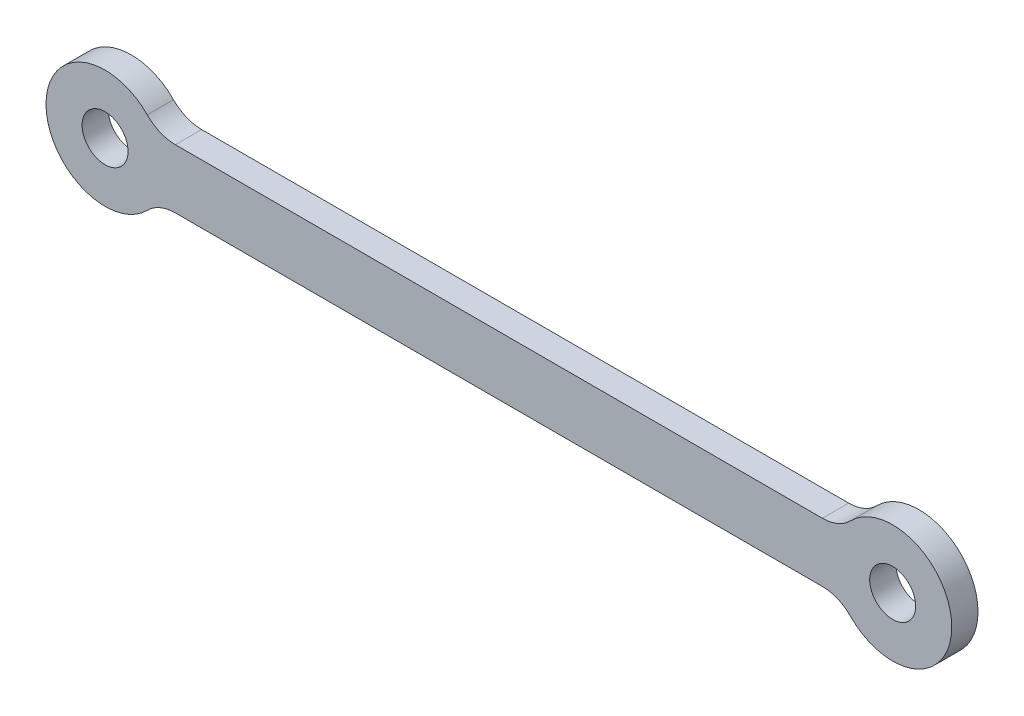
ISO-10303-21;
HEADER;
FILE_DESCRIPTION(('STEP AP214'),'2;1');
FILE_NAME('part.step','',(''),(''),'','','');
FILE_SCHEMA(('AUTOMOTIVE_DESIGN { 1 0 10303 214 1 1 1 1 }'));
ENDSEC;
DATA;
#1=APPLICATION_CONTEXT('core data for automotive mechanical design processes');
#2=APPLICATION_PROTOCOL_DEFINITION('international standard','automotive_design',2000,#1);
#3=PRODUCT_CONTEXT('',#1,'mechanical');
#4=PRODUCT('Part','Part','',(#3));
#5=PRODUCT_RELATED_PRODUCT_CATEGORY('part','',(#4));
#6=PRODUCT_DEFINITION_FORMATION('','',#4);
#7=PRODUCT_DEFINITION_CONTEXT('part definition',#1,'design');
#8=PRODUCT_DEFINITION('design','',#6,#7);
#9=PRODUCT_DEFINITION_SHAPE('','',#8);
#10=(LENGTH_UNIT() NAMED_UNIT(*) SI_UNIT(.MILLI.,.METRE.));
#11=(NAMED_UNIT(*) PLANE_ANGLE_UNIT() SI_UNIT($,.RADIAN.));
#12=(NAMED_UNIT(*) SI_UNIT($,.STERADIAN.) SOLID_ANGLE_UNIT());
#13=UNCERTAINTY_MEASURE_WITH_UNIT(LENGTH_MEASURE(1.E-05),#10,'distance_accuracy_value','');
#14=(GEOMETRIC_REPRESENTATION_CONTEXT(3) GLOBAL_UNCERTAINTY_ASSIGNED_CONTEXT((#13)) GLOBAL_UNIT_ASSIGNED_CONTEXT((#10,
#11,#12)) REPRESENTATION_CONTEXT('',''));
#15=CARTESIAN_POINT('',(0.,0.,0.));
#16=DIRECTION('',(0.,0.,1.));
#17=DIRECTION('',(1.,0.,0.));
#18=AXIS2_PLACEMENT_3D('',#15,#16,#17);
#19=CARTESIAN_POINT('',(54.6439286785929,-5.25,2.));
#20=DIRECTION('',(0.,0.,1.));
#21=DIRECTION('',(1.,0.,0.));
#22=AXIS2_PLACEMENT_3D('',#19,#20,#21);
#23=PLANE('',#22);
#24=CARTESIAN_POINT('',(0.,0.,2.));
#25=DIRECTION('',(0.,0.,1.));
#26=DIRECTION('',(1.,0.,0.));
#27=AXIS2_PLACEMENT_3D('',#24,#25,#26);
#28=CIRCLE('',#27,1.75);
#29=CARTESIAN_POINT('',(1.75,0.,2.));
#30=VERTEX_POINT('',#29);
#31=EDGE_CURVE('E138',#30,#30,#28,.T.);
#32=ORIENTED_EDGE('',*,*,#31,.F.);
#33=EDGE_LOOP('',(#32));
#34=FACE_BOUND('',#33,.T.);
#35=CARTESIAN_POINT('',(54.6439286785929,-5.25,2.));
#36=DIRECTION('',(0.,0.,-1.));
#37=DIRECTION('',(1.,0.,0.));
#38=AXIS2_PLACEMENT_3D('',#35,#36,#37);
#39=CIRCLE('',#38,3.);
#40=CARTESIAN_POINT('',(54.6439286785929,-2.25,2.));
#41=VERTEX_POINT('',#40);
#42=CARTESIAN_POINT('',(56.7863572071557,-3.15,2.));
#43=VERTEX_POINT('',#42);
#44=EDGE_CURVE('E149',#41,#43,#39,.T.);
#45=ORIENTED_EDGE('',*,*,#44,.T.);
#46=CARTESIAN_POINT('',(60.,0.,2.));
#47=DIRECTION('',(0.,0.,1.));
#48=DIRECTION('',(1.,0.,0.));
#49=AXIS2_PLACEMENT_3D('',#46,#47,#48);
#50=CIRCLE('',#49,4.50000000000001);
#51=CARTESIAN_POINT('',(56.7863572071557,3.15,2.));
#52=VERTEX_POINT('',#51);
#53=EDGE_CURVE('E97',#43,#52,#50,.T.);
#54=ORIENTED_EDGE('',*,*,#53,.T.);
#55=CARTESIAN_POINT('',(54.6439286785929,5.25,2.));
#56=DIRECTION('',(0.,0.,-1.));
#57=DIRECTION('',(1.,0.,0.));
#58=AXIS2_PLACEMENT_3D('',#55,#56,#57);
#59=CIRCLE('',#58,3.);
#60=CARTESIAN_POINT('',(54.6439286785929,2.25,2.));
#61=VERTEX_POINT('',#60);
#62=EDGE_CURVE('E164',#52,#61,#59,.T.);
#63=ORIENTED_EDGE('',*,*,#62,.T.);
#64=DIRECTION('',(-1.,0.,0.));
#65=VECTOR('',#64,1.);
#66=CARTESIAN_POINT('',(5.35607132140713,2.25000000000001,2.));
#67=LINE('',#66,#65);
#68=CARTESIAN_POINT('',(5.35607132140713,2.25000000000001,2.));
#69=VERTEX_POINT('',#68);
#70=EDGE_CURVE('E177',#61,#69,#67,.T.);
#71=ORIENTED_EDGE('',*,*,#70,.T.);
#72=CARTESIAN_POINT('',(5.35607132140713,5.25000000000001,2.));
#73=DIRECTION('',(0.,0.,-1.));
#74=DIRECTION('',(-1.,0.,0.));
#75=AXIS2_PLACEMENT_3D('',#72,#73,#74);
#76=CIRCLE('',#75,3.);
#77=CARTESIAN_POINT('',(3.21364279284428,3.15,2.));
#78=VERTEX_POINT('',#77);
#79=EDGE_CURVE('E116',#69,#78,#76,.T.);
#80=ORIENTED_EDGE('',*,*,#79,.T.);
#81=CARTESIAN_POINT('',(0.,0.,2.));
#82=DIRECTION('',(0.,0.,1.));
#83=DIRECTION('',(1.,0.,0.));
#84=AXIS2_PLACEMENT_3D('',#81,#82,#83);
#85=CIRCLE('',#84,4.5);
#86=CARTESIAN_POINT('',(3.21364279284428,-3.15,2.));
#87=VERTEX_POINT('',#86);
#88=EDGE_CURVE('E110',#78,#87,#85,.T.);
#89=ORIENTED_EDGE('',*,*,#88,.T.);
#90=CARTESIAN_POINT('',(5.35607132140713,-5.25000000000001,2.));
#91=DIRECTION('',(0.,0.,-1.));
#92=DIRECTION('',(1.,0.,0.));
#93=AXIS2_PLACEMENT_3D('',#90,#91,#92);
#94=CIRCLE('',#93,3.);
#95=CARTESIAN_POINT('',(5.35607132140713,-2.25000000000001,2.));
#96=VERTEX_POINT('',#95);
#97=EDGE_CURVE('E114',#87,#96,#94,.T.);
#98=ORIENTED_EDGE('',*,*,#97,.T.);
#99=DIRECTION('',(1.,0.,0.));
#100=VECTOR('',#99,1.);
#101=CARTESIAN_POINT('',(54.6439286785929,-2.25,2.));
#102=LINE('',#101,#100);
#103=EDGE_CURVE('E54',#96,#41,#102,.T.);
#104=ORIENTED_EDGE('',*,*,#103,.T.);
#105=EDGE_LOOP('',(#45,#54,#63,#71,#80,#89,#98,#104));
#106=FACE_BOUND('',#105,.T.);
#107=CARTESIAN_POINT('',(60.,0.,2.));
#108=DIRECTION('',(0.,0.,1.));
#109=DIRECTION('',(1.,0.,0.));
#110=AXIS2_PLACEMENT_3D('',#107,#108,#109);
#111=CIRCLE('',#110,1.75);
#112=CARTESIAN_POINT('',(61.75,0.,2.));
#113=VERTEX_POINT('',#112);
#114=EDGE_CURVE('E186',#113,#113,#111,.T.);
#115=ORIENTED_EDGE('',*,*,#114,.F.);
#116=EDGE_LOOP('',(#115));
#117=FACE_BOUND('',#116,.T.);
#118=ADVANCED_FACE('F37',(#34,#106,#117),#23,.T.);
#119=CARTESIAN_POINT('',(54.6439286785929,-5.25,0.));
#120=DIRECTION('',(0.,0.,1.));
#121=DIRECTION('',(1.,0.,0.));
#122=AXIS2_PLACEMENT_3D('',#119,#120,#121);
#123=PLANE('',#122);
#124=CARTESIAN_POINT('',(54.6439286785929,-5.25,0.));
#125=DIRECTION('',(0.,0.,-1.));
#126=DIRECTION('',(1.,0.,0.));
#127=AXIS2_PLACEMENT_3D('',#124,#125,#126);
#128=CIRCLE('',#127,3.);
#129=CARTESIAN_POINT('',(54.6439286785929,-2.25,0.));
#130=VERTEX_POINT('',#129);
#131=CARTESIAN_POINT('',(56.7863572071557,-3.15,0.));
#132=VERTEX_POINT('',#131);
#133=EDGE_CURVE('E134',#130,#132,#128,.T.);
#134=ORIENTED_EDGE('',*,*,#133,.F.);
#135=DIRECTION('',(1.,0.,0.));
#136=VECTOR('',#135,1.);
#137=CARTESIAN_POINT('',(54.6439286785929,-2.25,0.));
#138=LINE('',#137,#136);
#139=CARTESIAN_POINT('',(5.35607132140713,-2.25000000000001,0.));
#140=VERTEX_POINT('',#139);
#141=EDGE_CURVE('E89',#140,#130,#138,.T.);
#142=ORIENTED_EDGE('',*,*,#141,.F.);
#143=CARTESIAN_POINT('',(5.35607132140713,-5.25000000000001,0.));
#144=DIRECTION('',(0.,0.,-1.));
#145=DIRECTION('',(1.,0.,0.));
#146=AXIS2_PLACEMENT_3D('',#143,#144,#145);
#147=CIRCLE('',#146,3.);
#148=CARTESIAN_POINT('',(3.21364279284428,-3.15,0.));
#149=VERTEX_POINT('',#148);
#150=EDGE_CURVE('E83',#149,#140,#147,.T.);
#151=ORIENTED_EDGE('',*,*,#150,.F.);
#152=CARTESIAN_POINT('',(0.,0.,0.));
#153=DIRECTION('',(0.,0.,1.));
#154=DIRECTION('',(1.,0.,0.));
#155=AXIS2_PLACEMENT_3D('',#152,#153,#154);
#156=CIRCLE('',#155,4.5);
#157=CARTESIAN_POINT('',(3.21364279284428,3.15,0.));
#158=VERTEX_POINT('',#157);
#159=EDGE_CURVE('E124',#158,#149,#156,.T.);
#160=ORIENTED_EDGE('',*,*,#159,.F.);
#161=CARTESIAN_POINT('',(5.35607132140713,5.25000000000001,0.));
#162=DIRECTION('',(0.,0.,-1.));
#163=DIRECTION('',(-1.,0.,0.));
#164=AXIS2_PLACEMENT_3D('',#161,#162,#163);
#165=CIRCLE('',#164,3.);
#166=CARTESIAN_POINT('',(5.35607132140713,2.25000000000001,0.));
#167=VERTEX_POINT('',#166);
#168=EDGE_CURVE('E144',#167,#158,#165,.T.);
#169=ORIENTED_EDGE('',*,*,#168,.F.);
#170=DIRECTION('',(-1.,0.,0.));
#171=VECTOR('',#170,1.);
#172=CARTESIAN_POINT('',(5.35607132140713,2.25000000000001,0.));
#173=LINE('',#172,#171);
#174=CARTESIAN_POINT('',(54.6439286785929,2.25,0.));
#175=VERTEX_POINT('',#174);
#176=EDGE_CURVE('E142',#175,#167,#173,.T.);
#177=ORIENTED_EDGE('',*,*,#176,.F.);
#178=CARTESIAN_POINT('',(54.6439286785929,5.25,0.));
#179=DIRECTION('',(0.,0.,-1.));
#180=DIRECTION('',(1.,0.,0.));
#181=AXIS2_PLACEMENT_3D('',#178,#179,#180);
#182=CIRCLE('',#181,3.);
#183=CARTESIAN_POINT('',(56.7863572071557,3.15,0.));
#184=VERTEX_POINT('',#183);
#185=EDGE_CURVE('E140',#184,#175,#182,.T.);
#186=ORIENTED_EDGE('',*,*,#185,.F.);
#187=CARTESIAN_POINT('',(60.,0.,0.));
#188=DIRECTION('',(0.,0.,1.));
#189=DIRECTION('',(1.,0.,0.));
#190=AXIS2_PLACEMENT_3D('',#187,#188,#189);
#191=CIRCLE('',#190,4.50000000000001);
#192=EDGE_CURVE('E137',#132,#184,#191,.T.);
#193=ORIENTED_EDGE('',*,*,#192,.F.);
#194=EDGE_LOOP('',(#134,#142,#151,#160,#169,#177,#186,#193));
#195=FACE_BOUND('',#194,.T.);
#196=CARTESIAN_POINT('',(0.,0.,0.));
#197=DIRECTION('',(0.,0.,1.));
#198=DIRECTION('',(1.,0.,0.));
#199=AXIS2_PLACEMENT_3D('',#196,#197,#198);
#200=CIRCLE('',#199,1.75);
#201=CARTESIAN_POINT('',(1.75,0.,0.));
#202=VERTEX_POINT('',#201);
#203=EDGE_CURVE('E183',#202,#202,#200,.T.);
#204=ORIENTED_EDGE('',*,*,#203,.T.);
#205=EDGE_LOOP('',(#204));
#206=FACE_BOUND('',#205,.T.);
#207=CARTESIAN_POINT('',(60.,0.,0.));
#208=DIRECTION('',(0.,0.,1.));
#209=DIRECTION('',(1.,0.,0.));
#210=AXIS2_PLACEMENT_3D('',#207,#208,#209);
#211=CIRCLE('',#210,1.75);
#212=CARTESIAN_POINT('',(61.75,0.,0.));
#213=VERTEX_POINT('',#212);
#214=EDGE_CURVE('E189',#213,#213,#211,.T.);
#215=ORIENTED_EDGE('',*,*,#214,.T.);
#216=EDGE_LOOP('',(#215));
#217=FACE_BOUND('',#216,.T.);
#218=ADVANCED_FACE('F168',(#195,#206,#217),#123,.F.);
#219=CARTESIAN_POINT('',(54.6439286785929,-5.25,2.));
#220=DIRECTION('',(0.,0.,-1.));
#221=DIRECTION('',(-1.,0.,0.));
#222=AXIS2_PLACEMENT_3D('',#219,#220,#221);
#223=CYLINDRICAL_SURFACE('',#222,3.);
#224=ORIENTED_EDGE('',*,*,#133,.T.);
#225=DIRECTION('',(0.,0.,-1.));
#226=VECTOR('',#225,1.);
#227=CARTESIAN_POINT('',(56.7863572071557,-3.15,2.));
#228=LINE('',#227,#226);
#229=EDGE_CURVE('E11',#43,#132,#228,.T.);
#230=ORIENTED_EDGE('',*,*,#229,.F.);
#231=ORIENTED_EDGE('',*,*,#44,.F.);
#232=DIRECTION('',(0.,0.,-1.));
#233=VECTOR('',#232,1.);
#234=CARTESIAN_POINT('',(54.6439286785929,-2.25,2.));
#235=LINE('',#234,#233);
#236=EDGE_CURVE('E130',#41,#130,#235,.T.);
#237=ORIENTED_EDGE('',*,*,#236,.T.);
#238=EDGE_LOOP('',(#224,#230,#231,#237));
#239=FACE_BOUND('',#238,.T.);
#240=ADVANCED_FACE('F39',(#239),#223,.F.);
#241=CARTESIAN_POINT('',(60.,0.,2.));
#242=DIRECTION('',(0.,0.,-1.));
#243=DIRECTION('',(-1.,0.,0.));
#244=AXIS2_PLACEMENT_3D('',#241,#242,#243);
#245=CYLINDRICAL_SURFACE('',#244,4.50000000000001);
#246=ORIENTED_EDGE('',*,*,#192,.T.);
#247=DIRECTION('',(0.,0.,-1.));
#248=VECTOR('',#247,1.);
#249=CARTESIAN_POINT('',(56.7863572071557,3.15,2.));
#250=LINE('',#249,#248);
#251=EDGE_CURVE('E46',#52,#184,#250,.T.);
#252=ORIENTED_EDGE('',*,*,#251,.F.);
#253=ORIENTED_EDGE('',*,*,#53,.F.);
#254=ORIENTED_EDGE('',*,*,#229,.T.);
#255=EDGE_LOOP('',(#246,#252,#253,#254));
#256=FACE_BOUND('',#255,.T.);
#257=ADVANCED_FACE('F221',(#256),#245,.T.);
#258=CARTESIAN_POINT('',(54.6439286785929,5.25,2.));
#259=DIRECTION('',(0.,0.,-1.));
#260=DIRECTION('',(-1.,0.,0.));
#261=AXIS2_PLACEMENT_3D('',#258,#259,#260);
#262=CYLINDRICAL_SURFACE('',#261,3.);
#263=ORIENTED_EDGE('',*,*,#185,.T.);
#264=DIRECTION('',(0.,0.,-1.));
#265=VECTOR('',#264,1.);
#266=CARTESIAN_POINT('',(54.6439286785929,2.25,2.));
#267=LINE('',#266,#265);
#268=EDGE_CURVE('E156',#61,#175,#267,.T.);
#269=ORIENTED_EDGE('',*,*,#268,.F.);
#270=ORIENTED_EDGE('',*,*,#62,.F.);
#271=ORIENTED_EDGE('',*,*,#251,.T.);
#272=EDGE_LOOP('',(#263,#269,#270,#271));
#273=FACE_BOUND('',#272,.T.);
#274=ADVANCED_FACE('F162',(#273),#262,.F.);
#275=CARTESIAN_POINT('',(5.35607132140713,2.25000000000001,2.));
#276=DIRECTION('',(0.,-1.,0.));
#277=DIRECTION('',(1.,0.,0.));
#278=AXIS2_PLACEMENT_3D('',#275,#276,#277);
#279=PLANE('',#278);
#280=ORIENTED_EDGE('',*,*,#176,.T.);
#281=DIRECTION('',(0.,0.,-1.));
#282=VECTOR('',#281,1.);
#283=CARTESIAN_POINT('',(5.35607132140713,2.25000000000001,2.));
#284=LINE('',#283,#282);
#285=EDGE_CURVE('E153',#69,#167,#284,.T.);
#286=ORIENTED_EDGE('',*,*,#285,.F.);
#287=ORIENTED_EDGE('',*,*,#70,.F.);
#288=ORIENTED_EDGE('',*,*,#268,.T.);
#289=EDGE_LOOP('',(#280,#286,#287,#288));
#290=FACE_BOUND('',#289,.T.);
#291=ADVANCED_FACE('F173',(#290),#279,.F.);
#292=CARTESIAN_POINT('',(5.35607132140713,5.25000000000001,2.));
#293=DIRECTION('',(0.,0.,-1.));
#294=DIRECTION('',(-1.,0.,0.));
#295=AXIS2_PLACEMENT_3D('',#292,#293,#294);
#296=CYLINDRICAL_SURFACE('',#295,3.);
#297=ORIENTED_EDGE('',*,*,#168,.T.);
#298=DIRECTION('',(0.,0.,-1.));
#299=VECTOR('',#298,1.);
#300=CARTESIAN_POINT('',(3.21364279284428,3.15,2.));
#301=LINE('',#300,#299);
#302=EDGE_CURVE('E125',#78,#158,#301,.T.);
#303=ORIENTED_EDGE('',*,*,#302,.F.);
#304=ORIENTED_EDGE('',*,*,#79,.F.);
#305=ORIENTED_EDGE('',*,*,#285,.T.);
#306=EDGE_LOOP('',(#297,#303,#304,#305));
#307=FACE_BOUND('',#306,.T.);
#308=ADVANCED_FACE('F176',(#307),#296,.F.);
#309=CARTESIAN_POINT('',(0.,0.,2.));
#310=DIRECTION('',(0.,0.,-1.));
#311=DIRECTION('',(-1.,0.,0.));
#312=AXIS2_PLACEMENT_3D('',#309,#310,#311);
#313=CYLINDRICAL_SURFACE('',#312,4.5);
#314=ORIENTED_EDGE('',*,*,#159,.T.);
#315=DIRECTION('',(0.,0.,-1.));
#316=VECTOR('',#315,1.);
#317=CARTESIAN_POINT('',(3.21364279284428,-3.15,2.));
#318=LINE('',#317,#316);
#319=EDGE_CURVE('E121',#87,#149,#318,.T.);
#320=ORIENTED_EDGE('',*,*,#319,.F.);
#321=ORIENTED_EDGE('',*,*,#88,.F.);
#322=ORIENTED_EDGE('',*,*,#302,.T.);
#323=EDGE_LOOP('',(#314,#320,#321,#322));
#324=FACE_BOUND('',#323,.T.);
#325=ADVANCED_FACE('F122',(#324),#313,.T.);
#326=CARTESIAN_POINT('',(5.35607132140713,-5.25000000000001,2.));
#327=DIRECTION('',(0.,0.,-1.));
#328=DIRECTION('',(-1.,0.,0.));
#329=AXIS2_PLACEMENT_3D('',#326,#327,#328);
#330=CYLINDRICAL_SURFACE('',#329,3.);
#331=ORIENTED_EDGE('',*,*,#150,.T.);
#332=DIRECTION('',(0.,0.,-1.));
#333=VECTOR('',#332,1.);
#334=CARTESIAN_POINT('',(5.35607132140713,-2.25000000000001,2.));
#335=LINE('',#334,#333);
#336=EDGE_CURVE('E126',#96,#140,#335,.T.);
#337=ORIENTED_EDGE('',*,*,#336,.F.);
#338=ORIENTED_EDGE('',*,*,#97,.F.);
#339=ORIENTED_EDGE('',*,*,#319,.T.);
#340=EDGE_LOOP('',(#331,#337,#338,#339));
#341=FACE_BOUND('',#340,.T.);
#342=ADVANCED_FACE('F128',(#341),#330,.F.);
#343=CARTESIAN_POINT('',(54.6439286785929,-2.25,2.));
#344=DIRECTION('',(0.,1.,0.));
#345=DIRECTION('',(-1.,0.,0.));
#346=AXIS2_PLACEMENT_3D('',#343,#344,#345);
#347=PLANE('',#346);
#348=ORIENTED_EDGE('',*,*,#141,.T.);
#349=ORIENTED_EDGE('',*,*,#236,.F.);
#350=ORIENTED_EDGE('',*,*,#103,.F.);
#351=ORIENTED_EDGE('',*,*,#336,.T.);
#352=EDGE_LOOP('',(#348,#349,#350,#351));
#353=FACE_BOUND('',#352,.T.);
#354=ADVANCED_FACE('F209',(#353),#347,.F.);
#355=CARTESIAN_POINT('',(0.,0.,2.));
#356=DIRECTION('',(0.,0.,-1.));
#357=DIRECTION('',(-1.,0.,0.));
#358=AXIS2_PLACEMENT_3D('',#355,#356,#357);
#359=CYLINDRICAL_SURFACE('',#358,1.75);
#360=ORIENTED_EDGE('',*,*,#31,.T.);
#361=EDGE_LOOP('',(#360));
#362=FACE_BOUND('',#361,.T.);
#363=ORIENTED_EDGE('',*,*,#203,.F.);
#364=EDGE_LOOP('',(#363));
#365=FACE_BOUND('',#364,.T.);
#366=ADVANCED_FACE('F206',(#362,#365),#359,.F.);
#367=CARTESIAN_POINT('',(60.,0.,2.));
#368=DIRECTION('',(0.,0.,-1.));
#369=DIRECTION('',(-1.,0.,0.));
#370=AXIS2_PLACEMENT_3D('',#367,#368,#369);
#371=CYLINDRICAL_SURFACE('',#370,1.75);
#372=ORIENTED_EDGE('',*,*,#114,.T.);
#373=EDGE_LOOP('',(#372));
#374=FACE_BOUND('',#373,.T.);
#375=ORIENTED_EDGE('',*,*,#214,.F.);
#376=EDGE_LOOP('',(#375));
#377=FACE_BOUND('',#376,.T.);
#378=ADVANCED_FACE('F195',(#374,#377),#371,.F.);
#379=CLOSED_SHELL('',(#118,#218,#240,#257,#274,#291,#308,#325,#342,#354,#366,#378));
#380=MANIFOLD_SOLID_BREP('B2',#379);
#381=ADVANCED_BREP_SHAPE_REPRESENTATION('',(#18,#380),#14);
#382=SHAPE_DEFINITION_REPRESENTATION(#9,#381);
ENDSEC;
END-ISO-10303-21;
